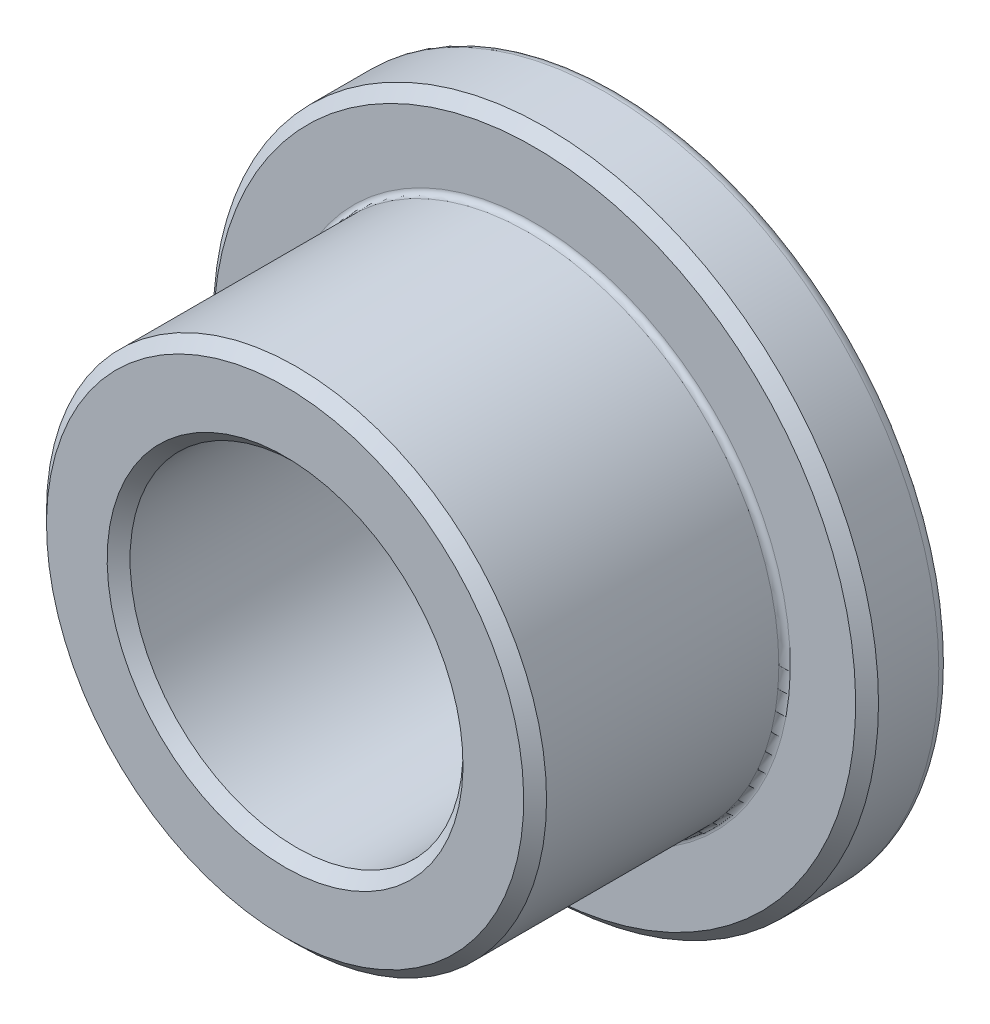
ISO-10303-21;
HEADER;
FILE_DESCRIPTION(('STEP AP214'),'2;1');
FILE_NAME('part.step','',(''),(''),'','','');
FILE_SCHEMA(('AUTOMOTIVE_DESIGN { 1 0 10303 214 1 1 1 1 }'));
ENDSEC;
DATA;
#1=APPLICATION_CONTEXT('core data for automotive mechanical design processes');
#2=APPLICATION_PROTOCOL_DEFINITION('international standard','automotive_design',2000,#1);
#3=PRODUCT_CONTEXT('',#1,'mechanical');
#4=PRODUCT('Part','Part','',(#3));
#5=PRODUCT_RELATED_PRODUCT_CATEGORY('part','',(#4));
#6=PRODUCT_DEFINITION_FORMATION('','',#4);
#7=PRODUCT_DEFINITION_CONTEXT('part definition',#1,'design');
#8=PRODUCT_DEFINITION('design','',#6,#7);
#9=PRODUCT_DEFINITION_SHAPE('','',#8);
#10=(LENGTH_UNIT() NAMED_UNIT(*) SI_UNIT(.MILLI.,.METRE.));
#11=(NAMED_UNIT(*) PLANE_ANGLE_UNIT() SI_UNIT($,.RADIAN.));
#12=(NAMED_UNIT(*) SI_UNIT($,.STERADIAN.) SOLID_ANGLE_UNIT());
#13=UNCERTAINTY_MEASURE_WITH_UNIT(LENGTH_MEASURE(1.E-05),#10,'distance_accuracy_value','');
#14=(GEOMETRIC_REPRESENTATION_CONTEXT(3) GLOBAL_UNCERTAINTY_ASSIGNED_CONTEXT((#13)) GLOBAL_UNIT_ASSIGNED_CONTEXT((#10,
#11,#12)) REPRESENTATION_CONTEXT('',''));
#15=CARTESIAN_POINT('',(0.,0.,0.));
#16=DIRECTION('',(0.,0.,1.));
#17=DIRECTION('',(1.,0.,0.));
#18=AXIS2_PLACEMENT_3D('',#15,#16,#17);
#19=CARTESIAN_POINT('',(0.,8.,-4.));
#20=DIRECTION('',(0.,0.,-1.));
#21=DIRECTION('',(0.,1.,0.));
#22=AXIS2_PLACEMENT_3D('',#19,#20,#21);
#23=PLANE('',#22);
#24=CARTESIAN_POINT('',(0.,0.,-4.));
#25=DIRECTION('',(0.,0.,-1.));
#26=DIRECTION('',(0.,1.,0.));
#27=AXIS2_PLACEMENT_3D('',#24,#25,#26);
#28=CIRCLE('',#27,7.725);
#29=CARTESIAN_POINT('',(0.,7.725,-4.));
#30=VERTEX_POINT('',#29);
#31=EDGE_CURVE('E59',#30,#30,#28,.T.);
#32=ORIENTED_EDGE('',*,*,#31,.T.);
#33=EDGE_LOOP('',(#32));
#34=FACE_BOUND('',#33,.T.);
#35=CARTESIAN_POINT('',(0.,0.,-4.));
#36=DIRECTION('',(0.,0.,-1.));
#37=DIRECTION('',(0.,1.,0.));
#38=AXIS2_PLACEMENT_3D('',#35,#36,#37);
#39=CIRCLE('',#38,4.005);
#40=CARTESIAN_POINT('',(0.,4.005,-4.));
#41=VERTEX_POINT('',#40);
#42=EDGE_CURVE('E89',#41,#41,#39,.T.);
#43=ORIENTED_EDGE('',*,*,#42,.F.);
#44=EDGE_LOOP('',(#43));
#45=FACE_BOUND('',#44,.T.);
#46=ADVANCED_FACE('F41',(#34,#45),#23,.T.);
#47=CARTESIAN_POINT('',(0.,0.,-4.));
#48=DIRECTION('',(0.,0.,-1.));
#49=DIRECTION('',(0.,1.,0.));
#50=AXIS2_PLACEMENT_3D('',#47,#48,#49);
#51=CYLINDRICAL_SURFACE('',#50,8.);
#52=CARTESIAN_POINT('',(0.,0.,-3.725));
#53=DIRECTION('',(0.,0.,-1.));
#54=DIRECTION('',(0.,1.,0.));
#55=AXIS2_PLACEMENT_3D('',#52,#53,#54);
#56=CIRCLE('',#55,8.);
#57=CARTESIAN_POINT('',(0.,8.,-3.725));
#58=VERTEX_POINT('',#57);
#59=EDGE_CURVE('E54',#58,#58,#56,.F.);
#60=ORIENTED_EDGE('',*,*,#59,.T.);
#61=EDGE_LOOP('',(#60));
#62=FACE_BOUND('',#61,.T.);
#63=CARTESIAN_POINT('',(0.,0.,-2.275));
#64=DIRECTION('',(0.,0.,1.));
#65=DIRECTION('',(0.,-1.,0.));
#66=AXIS2_PLACEMENT_3D('',#63,#64,#65);
#67=CIRCLE('',#66,8.);
#68=CARTESIAN_POINT('',(0.,-8.,-2.275));
#69=VERTEX_POINT('',#68);
#70=EDGE_CURVE('E85',#69,#69,#67,.F.);
#71=ORIENTED_EDGE('',*,*,#70,.T.);
#72=EDGE_LOOP('',(#71));
#73=FACE_BOUND('',#72,.T.);
#74=ADVANCED_FACE('F97',(#62,#73),#51,.T.);
#75=CARTESIAN_POINT('',(0.,8.,-2.));
#76=DIRECTION('',(0.,0.,1.));
#77=DIRECTION('',(0.,-1.,0.));
#78=AXIS2_PLACEMENT_3D('',#75,#76,#77);
#79=PLANE('',#78);
#80=CARTESIAN_POINT('',(0.,0.,-2.));
#81=DIRECTION('',(0.,0.,1.));
#82=DIRECTION('',(0.,-1.,0.));
#83=AXIS2_PLACEMENT_3D('',#80,#81,#82);
#84=CIRCLE('',#83,6.1525);
#85=CARTESIAN_POINT('',(0.,-6.1525,-2.));
#86=VERTEX_POINT('',#85);
#87=EDGE_CURVE('E49',#86,#86,#84,.F.);
#88=ORIENTED_EDGE('',*,*,#87,.T.);
#89=EDGE_LOOP('',(#88));
#90=FACE_BOUND('',#89,.T.);
#91=CARTESIAN_POINT('',(0.,0.,-2.));
#92=DIRECTION('',(0.,0.,1.));
#93=DIRECTION('',(0.,-1.,0.));
#94=AXIS2_PLACEMENT_3D('',#91,#92,#93);
#95=CIRCLE('',#94,7.725);
#96=CARTESIAN_POINT('',(0.,-7.725,-2.));
#97=VERTEX_POINT('',#96);
#98=EDGE_CURVE('E81',#97,#97,#95,.T.);
#99=ORIENTED_EDGE('',*,*,#98,.T.);
#100=EDGE_LOOP('',(#99));
#101=FACE_BOUND('',#100,.T.);
#102=ADVANCED_FACE('F104',(#90,#101),#79,.T.);
#103=CARTESIAN_POINT('',(0.,0.,-4.));
#104=DIRECTION('',(0.,0.,-1.));
#105=DIRECTION('',(0.,1.,0.));
#106=AXIS2_PLACEMENT_3D('',#103,#104,#105);
#107=CYLINDRICAL_SURFACE('',#106,6.015);
#108=CARTESIAN_POINT('',(0.,0.,-1.8625));
#109=DIRECTION('',(0.,0.,1.));
#110=DIRECTION('',(0.,-1.,0.));
#111=AXIS2_PLACEMENT_3D('',#108,#109,#110);
#112=CIRCLE('',#111,6.015);
#113=CARTESIAN_POINT('',(0.,-6.015,-1.8625));
#114=VERTEX_POINT('',#113);
#115=EDGE_CURVE('E10',#114,#114,#112,.T.);
#116=ORIENTED_EDGE('',*,*,#115,.T.);
#117=EDGE_LOOP('',(#116));
#118=FACE_BOUND('',#117,.T.);
#119=CARTESIAN_POINT('',(0.,0.,3.72499999999999));
#120=DIRECTION('',(0.,0.,1.));
#121=DIRECTION('',(0.,-1.,0.));
#122=AXIS2_PLACEMENT_3D('',#119,#120,#121);
#123=CIRCLE('',#122,6.015);
#124=CARTESIAN_POINT('',(0.,-6.015,3.72499999999999));
#125=VERTEX_POINT('',#124);
#126=EDGE_CURVE('E77',#125,#125,#123,.F.);
#127=ORIENTED_EDGE('',*,*,#126,.T.);
#128=EDGE_LOOP('',(#127));
#129=FACE_BOUND('',#128,.T.);
#130=ADVANCED_FACE('F139',(#118,#129),#107,.T.);
#131=CARTESIAN_POINT('',(0.,6.015,4.));
#132=DIRECTION('',(0.,0.,1.));
#133=DIRECTION('',(0.,-1.,0.));
#134=AXIS2_PLACEMENT_3D('',#131,#132,#133);
#135=PLANE('',#134);
#136=CARTESIAN_POINT('',(0.,0.,4.));
#137=DIRECTION('',(0.,0.,1.));
#138=DIRECTION('',(0.,-1.,0.));
#139=AXIS2_PLACEMENT_3D('',#136,#137,#138);
#140=CIRCLE('',#139,5.74);
#141=CARTESIAN_POINT('',(0.,-5.74,4.));
#142=VERTEX_POINT('',#141);
#143=EDGE_CURVE('E69',#142,#142,#140,.T.);
#144=ORIENTED_EDGE('',*,*,#143,.T.);
#145=EDGE_LOOP('',(#144));
#146=FACE_BOUND('',#145,.T.);
#147=CARTESIAN_POINT('',(0.,0.,4.));
#148=DIRECTION('',(0.,0.,1.));
#149=DIRECTION('',(0.,-1.,0.));
#150=AXIS2_PLACEMENT_3D('',#147,#148,#149);
#151=CIRCLE('',#150,4.28);
#152=CARTESIAN_POINT('',(0.,-4.28,4.));
#153=VERTEX_POINT('',#152);
#154=EDGE_CURVE('E73',#153,#153,#151,.F.);
#155=ORIENTED_EDGE('',*,*,#154,.T.);
#156=EDGE_LOOP('',(#155));
#157=FACE_BOUND('',#156,.T.);
#158=ADVANCED_FACE('F142',(#146,#157),#135,.T.);
#159=CARTESIAN_POINT('',(0.,0.,-4.));
#160=DIRECTION('',(0.,0.,-1.));
#161=DIRECTION('',(0.,1.,0.));
#162=AXIS2_PLACEMENT_3D('',#159,#160,#161);
#163=CYLINDRICAL_SURFACE('',#162,4.005);
#164=CARTESIAN_POINT('',(0.,0.,3.725));
#165=DIRECTION('',(0.,0.,1.));
#166=DIRECTION('',(0.,-1.,0.));
#167=AXIS2_PLACEMENT_3D('',#164,#165,#166);
#168=CIRCLE('',#167,4.005);
#169=CARTESIAN_POINT('',(0.,-4.005,3.725));
#170=VERTEX_POINT('',#169);
#171=EDGE_CURVE('E65',#170,#170,#168,.T.);
#172=ORIENTED_EDGE('',*,*,#171,.T.);
#173=EDGE_LOOP('',(#172));
#174=FACE_BOUND('',#173,.T.);
#175=ORIENTED_EDGE('',*,*,#42,.T.);
#176=EDGE_LOOP('',(#175));
#177=FACE_BOUND('',#176,.T.);
#178=ADVANCED_FACE('F94',(#174,#177),#163,.F.);
#179=CARTESIAN_POINT('',(0.,0.,-2.275));
#180=DIRECTION('',(0.,0.,-1.));
#181=DIRECTION('',(0.,1.,0.));
#182=AXIS2_PLACEMENT_3D('',#179,#180,#181);
#183=CONICAL_SURFACE('',#182,8.,0.785398163397448);
#184=ORIENTED_EDGE('',*,*,#98,.F.);
#185=EDGE_LOOP('',(#184));
#186=FACE_BOUND('',#185,.T.);
#187=ORIENTED_EDGE('',*,*,#70,.F.);
#188=EDGE_LOOP('',(#187));
#189=FACE_BOUND('',#188,.T.);
#190=ADVANCED_FACE('F109',(#186,#189),#183,.T.);
#191=CARTESIAN_POINT('',(0.,0.,3.72499999999999));
#192=DIRECTION('',(0.,0.,-1.));
#193=DIRECTION('',(0.,1.,0.));
#194=AXIS2_PLACEMENT_3D('',#191,#192,#193);
#195=CONICAL_SURFACE('',#194,6.015,0.785398163397445);
#196=ORIENTED_EDGE('',*,*,#143,.F.);
#197=EDGE_LOOP('',(#196));
#198=FACE_BOUND('',#197,.T.);
#199=ORIENTED_EDGE('',*,*,#126,.F.);
#200=EDGE_LOOP('',(#199));
#201=FACE_BOUND('',#200,.T.);
#202=ADVANCED_FACE('F112',(#198,#201),#195,.T.);
#203=CARTESIAN_POINT('',(0.,0.,4.));
#204=DIRECTION('',(0.,0.,1.));
#205=DIRECTION('',(0.,-1.,0.));
#206=AXIS2_PLACEMENT_3D('',#203,#204,#205);
#207=CONICAL_SURFACE('',#206,4.28,0.785398163397445);
#208=ORIENTED_EDGE('',*,*,#171,.F.);
#209=EDGE_LOOP('',(#208));
#210=FACE_BOUND('',#209,.T.);
#211=ORIENTED_EDGE('',*,*,#154,.F.);
#212=EDGE_LOOP('',(#211));
#213=FACE_BOUND('',#212,.T.);
#214=ADVANCED_FACE('F116',(#210,#213),#207,.F.);
#215=CARTESIAN_POINT('',(0.,0.,-3.725));
#216=DIRECTION('',(0.,0.,-1.));
#217=DIRECTION('',(0.,1.,0.));
#218=AXIS2_PLACEMENT_3D('',#215,#216,#217);
#219=TOROIDAL_SURFACE('',#218,7.725,0.275);
#220=ORIENTED_EDGE('',*,*,#59,.F.);
#221=EDGE_LOOP('',(#220));
#222=FACE_BOUND('',#221,.T.);
#223=ORIENTED_EDGE('',*,*,#31,.F.);
#224=EDGE_LOOP('',(#223));
#225=FACE_BOUND('',#224,.T.);
#226=ADVANCED_FACE('F118',(#222,#225),#219,.T.);
#227=CARTESIAN_POINT('',(0.,0.,-1.8625));
#228=DIRECTION('',(0.,0.,1.));
#229=DIRECTION('',(0.,-1.,0.));
#230=AXIS2_PLACEMENT_3D('',#227,#228,#229);
#231=TOROIDAL_SURFACE('',#230,6.1525,0.1375);
#232=ORIENTED_EDGE('',*,*,#115,.F.);
#233=EDGE_LOOP('',(#232));
#234=FACE_BOUND('',#233,.T.);
#235=ORIENTED_EDGE('',*,*,#87,.F.);
#236=EDGE_LOOP('',(#235));
#237=FACE_BOUND('',#236,.T.);
#238=ADVANCED_FACE('F43',(#234,#237),#231,.F.);
#239=CLOSED_SHELL('',(#46,#74,#102,#130,#158,#178,#190,#202,#214,#226,#238));
#240=MANIFOLD_SOLID_BREP('B2',#239);
#241=ADVANCED_BREP_SHAPE_REPRESENTATION('',(#18,#240),#14);
#242=SHAPE_DEFINITION_REPRESENTATION(#9,#241);
ENDSEC;
END-ISO-10303-21;
